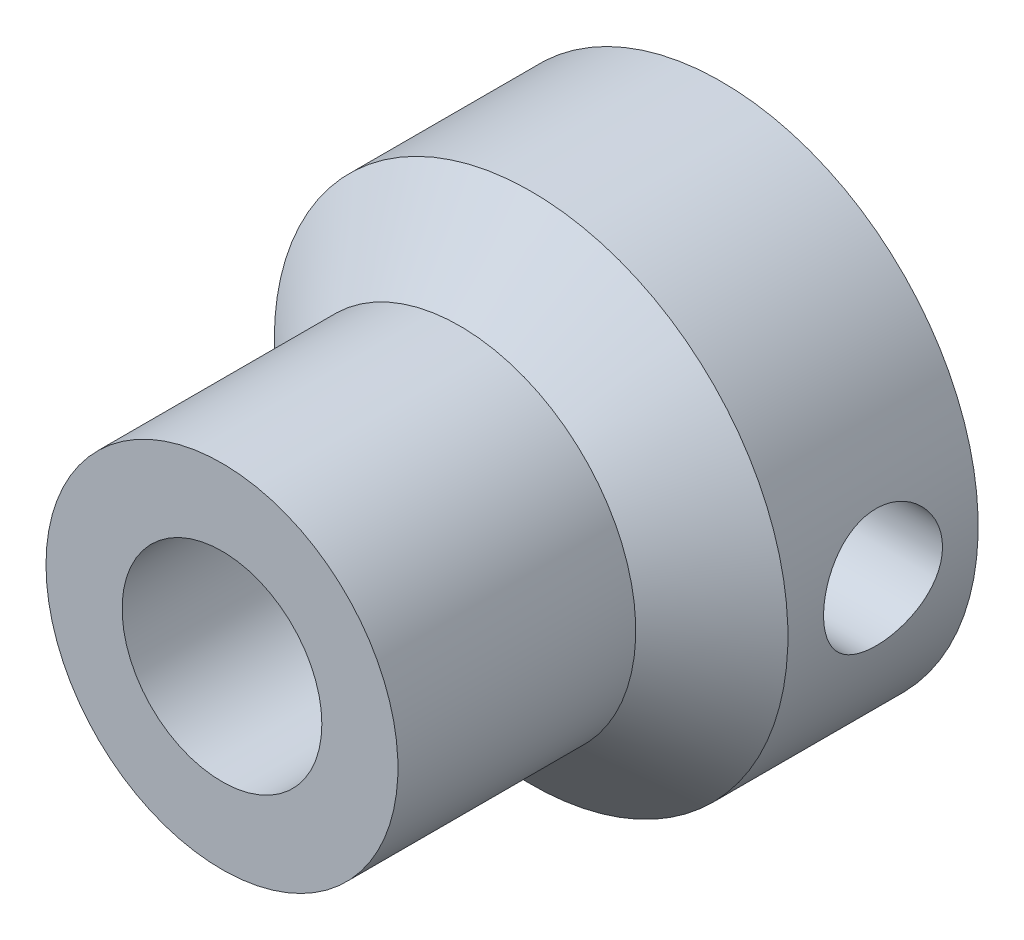
ISO-10303-21;
HEADER;
FILE_DESCRIPTION(('STEP AP214'),'2;1');
FILE_NAME('part.step','',(''),(''),'','','');
FILE_SCHEMA(('AUTOMOTIVE_DESIGN { 1 0 10303 214 1 1 1 1 }'));
ENDSEC;
DATA;
#1=APPLICATION_CONTEXT('core data for automotive mechanical design processes');
#2=APPLICATION_PROTOCOL_DEFINITION('international standard','automotive_design',2000,#1);
#3=PRODUCT_CONTEXT('',#1,'mechanical');
#4=PRODUCT('Part','Part','',(#3));
#5=PRODUCT_RELATED_PRODUCT_CATEGORY('part','',(#4));
#6=PRODUCT_DEFINITION_FORMATION('','',#4);
#7=PRODUCT_DEFINITION_CONTEXT('part definition',#1,'design');
#8=PRODUCT_DEFINITION('design','',#6,#7);
#9=PRODUCT_DEFINITION_SHAPE('','',#8);
#10=(LENGTH_UNIT() NAMED_UNIT(*) SI_UNIT(.MILLI.,.METRE.));
#11=(NAMED_UNIT(*) PLANE_ANGLE_UNIT() SI_UNIT($,.RADIAN.));
#12=(NAMED_UNIT(*) SI_UNIT($,.STERADIAN.) SOLID_ANGLE_UNIT());
#13=UNCERTAINTY_MEASURE_WITH_UNIT(LENGTH_MEASURE(1.E-05),#10,'distance_accuracy_value','');
#14=(GEOMETRIC_REPRESENTATION_CONTEXT(3) GLOBAL_UNCERTAINTY_ASSIGNED_CONTEXT((#13)) GLOBAL_UNIT_ASSIGNED_CONTEXT((#10,
#11,#12)) REPRESENTATION_CONTEXT('',''));
#15=CARTESIAN_POINT('',(0.,0.,0.));
#16=DIRECTION('',(0.,0.,1.));
#17=DIRECTION('',(1.,0.,0.));
#18=AXIS2_PLACEMENT_3D('',#15,#16,#17);
#19=CARTESIAN_POINT('',(0.,0.,0.));
#20=DIRECTION('',(0.,0.,-1.));
#21=DIRECTION('',(-1.,0.,0.));
#22=AXIS2_PLACEMENT_3D('',#19,#20,#21);
#23=CYLINDRICAL_SURFACE('',#22,2.5);
#24=CARTESIAN_POINT('',(-2.5,0.,3.25));
#25=CARTESIAN_POINT('',(-2.49999641755189,-0.0657149536912331,3.24999587210062));
#26=CARTESIAN_POINT('',(-2.49738113774397,-0.131508249622541,3.2447874085979));
#27=CARTESIAN_POINT('',(-2.48717695046745,-0.261150294085531,3.22418389957385));
#28=CARTESIAN_POINT('',(-2.47957859786229,-0.324995108391879,3.20876950875294));
#29=CARTESIAN_POINT('',(-2.4602034925414,-0.448666931100718,3.16850773922901));
#30=CARTESIAN_POINT('',(-2.448442989719,-0.508508503673975,3.14369701968998));
#31=CARTESIAN_POINT('',(-2.42182220644723,-0.623090771008206,3.08553672329382));
#32=CARTESIAN_POINT('',(-2.40696217041913,-0.677831867487562,3.05218781968893));
#33=CARTESIAN_POINT('',(-2.37445322822571,-0.784384772202398,2.97560343814338));
#34=CARTESIAN_POINT('',(-2.3566899890942,-0.835819013902639,2.93189190095045));
#35=CARTESIAN_POINT('',(-2.32074962808431,-0.930974306083721,2.83684815094121));
#36=CARTESIAN_POINT('',(-2.30257220261294,-0.974689478883457,2.78551018528445));
#37=CARTESIAN_POINT('',(-2.26623688996684,-1.05656500056285,2.67189581309577));
#38=CARTESIAN_POINT('',(-2.24818983712665,-1.09403166943955,2.60907987706761));
#39=CARTESIAN_POINT('',(-2.21607473465401,-1.15771028361337,2.47704083001723));
#40=CARTESIAN_POINT('',(-2.20200384508737,-1.18393026870792,2.40782233909656));
#41=CARTESIAN_POINT('',(-2.18072333797261,-1.22266555273573,2.2691686182226));
#42=CARTESIAN_POINT('',(-2.17315339479642,-1.23590732135055,2.19999443491576));
#43=CARTESIAN_POINT('',(-2.1647736243566,-1.25053374163606,2.06002645277565));
#44=CARTESIAN_POINT('',(-2.1639571167911,-1.25193011046634,1.98923432391106));
#45=CARTESIAN_POINT('',(-2.16888662821561,-1.24335910896537,1.85714246960579));
#46=CARTESIAN_POINT('',(-2.17385954577517,-1.23473069942103,1.79571996097119));
#47=CARTESIAN_POINT('',(-2.18845285917313,-1.20867481132116,1.6753476132837));
#48=CARTESIAN_POINT('',(-2.1980747353972,-1.19124452987206,1.61639856836836));
#49=CARTESIAN_POINT('',(-2.22109345515926,-1.1477622254825,1.50096358429293));
#50=CARTESIAN_POINT('',(-2.23457300829998,-1.12151883389499,1.44456700151776));
#51=CARTESIAN_POINT('',(-2.26379255351755,-1.061302109585,1.33670713426249));
#52=CARTESIAN_POINT('',(-2.27953355975238,-1.02732530476558,1.28524608049989));
#53=CARTESIAN_POINT('',(-2.31391447379107,-0.947582568640985,1.18184843407097));
#54=CARTESIAN_POINT('',(-2.33266887795933,-0.900868072961601,1.1306789080298));
#55=CARTESIAN_POINT('',(-2.36934529125509,-0.799444473426716,1.03658072676137));
#56=CARTESIAN_POINT('',(-2.38726689948501,-0.744731570717856,0.993656009957648));
#57=CARTESIAN_POINT('',(-2.42127484103705,-0.62564563228981,0.915392923712842));
#58=CARTESIAN_POINT('',(-2.43723730202509,-0.56094198949926,0.880499409442826));
#59=CARTESIAN_POINT('',(-2.46447351401553,-0.425582769360996,0.82237871369624));
#60=CARTESIAN_POINT('',(-2.47575098679441,-0.354931970331595,0.799142268731042));
#61=CARTESIAN_POINT('',(-2.49155417176795,-0.215958114575877,0.766905745354157));
#62=CARTESIAN_POINT('',(-2.4965617287664,-0.147926913185405,0.756885955316528));
#63=CARTESIAN_POINT('',(-2.50091266823877,-0.0109744999366922,0.748169086081889));
#64=CARTESIAN_POINT('',(-2.5002587340164,0.0579462748373765,0.749466642950652));
#65=CARTESIAN_POINT('',(-2.49363990316801,0.189041214982491,0.762758360523444));
#66=CARTESIAN_POINT('',(-2.48809057110237,0.251324260062442,0.773915665912539));
#67=CARTESIAN_POINT('',(-2.47277714143524,0.373008615377395,0.805297589868858));
#68=CARTESIAN_POINT('',(-2.46301257917916,0.432409607113745,0.8255232080667));
#69=CARTESIAN_POINT('',(-2.43980314267087,0.548610760562081,0.874998083041466));
#70=CARTESIAN_POINT('',(-2.42626102212424,0.605287996257691,0.904488812646017));
#71=CARTESIAN_POINT('',(-2.39679967896386,0.71307670212365,0.971384419557553));
#72=CARTESIAN_POINT('',(-2.38087944457231,0.764185787219102,1.00879266824179));
#73=CARTESIAN_POINT('',(-2.34635276671831,0.864709611613315,1.09470053166609));
#74=CARTESIAN_POINT('',(-2.32763606060552,0.913465097280798,1.14392858556696));
#75=CARTESIAN_POINT('',(-2.29077989504843,1.00232040139155,1.24990643908663));
#76=CARTESIAN_POINT('',(-2.27264084226908,1.04241423211355,1.30666139852047));
#77=CARTESIAN_POINT('',(-2.23813990282585,1.11463489312212,1.42955456775039));
#78=CARTESIAN_POINT('',(-2.2219066207934,1.1462818698483,1.49601408276074));
#79=CARTESIAN_POINT('',(-2.19467590460158,1.19760353251725,1.63438758461565));
#80=CARTESIAN_POINT('',(-2.18367172800773,1.21729364485946,1.70629440812648));
#81=CARTESIAN_POINT('',(-2.16951876260834,1.2423271093121,1.84613777857681));
#82=CARTESIAN_POINT('',(-2.16571729325614,1.24886624550108,1.91379281678629));
#83=CARTESIAN_POINT('',(-2.16456693307719,1.25086144297598,2.04930883396341));
#84=CARTESIAN_POINT('',(-2.16721524534441,1.2463223082805,2.11716971092429));
#85=CARTESIAN_POINT('',(-2.17797327562531,1.22740765699033,2.24435437691502));
#86=CARTESIAN_POINT('',(-2.18553868102992,1.2140103929285,2.3038755876805));
#87=CARTESIAN_POINT('',(-2.20463770234897,1.17896919778081,2.41976014928088));
#88=CARTESIAN_POINT('',(-2.21617259462095,1.15732261394976,2.47612247761496));
#89=CARTESIAN_POINT('',(-2.2428566295566,1.10476968162585,2.58828106373326));
#90=CARTESIAN_POINT('',(-2.25819652995238,1.07333892227057,2.64378487728712));
#91=CARTESIAN_POINT('',(-2.29044164543238,1.00268871454579,2.74909317022573));
#92=CARTESIAN_POINT('',(-2.30734767243153,0.963465214048309,2.79889466314811));
#93=CARTESIAN_POINT('',(-2.34327903949141,0.872754158330801,2.89767747794702));
#94=CARTESIAN_POINT('',(-2.36231229139336,0.820355528762713,2.9458238779524));
#95=CARTESIAN_POINT('',(-2.3984719031886,0.707693507775349,3.03282872927954));
#96=CARTESIAN_POINT('',(-2.4155972326005,0.647425904070981,3.07168217428286));
#97=CARTESIAN_POINT('',(-2.44622511981379,0.519914496024933,3.13904545345275));
#98=CARTESIAN_POINT('',(-2.45970120703636,0.452624379918268,3.16748021176429));
#99=CARTESIAN_POINT('',(-2.48126676704332,0.313427626617739,3.21226020989869));
#100=CARTESIAN_POINT('',(-2.48937154216165,0.241534749528958,3.22863980853697));
#101=CARTESIAN_POINT('',(-2.49619327387079,0.14075243310423,3.24237176384481));
#102=CARTESIAN_POINT('',(-2.49761706674002,0.112702349299373,3.24522830107952));
#103=CARTESIAN_POINT('',(-2.49952121222331,0.0564396647589472,3.24904333189601));
#104=CARTESIAN_POINT('',(-2.50000153879704,0.0282270595592268,3.250001773089));
#105=CARTESIAN_POINT('',(-2.5,0.,3.25));
#106=B_SPLINE_CURVE_WITH_KNOTS('',3,(#24,#25,#26,#27,#28,#29,#30,#31,#32,#33,#34,#35,#36,#37,
#38,#39,#40,#41,#42,#43,#44,#45,#46,#47,#48,#49,#50,#51,#52,#53,#54,#55,#56,#57,#58,#59,#60,#61,
#62,#63,#64,#65,#66,#67,#68,#69,#70,#71,#72,#73,#74,#75,#76,#77,#78,#79,#80,#81,#82,#83,#84,#85,
#86,#87,#88,#89,#90,#91,#92,#93,#94,#95,#96,#97,#98,#99,#100,#101,#102,#103,#104,#105),
.UNSPECIFIED.,.T.,.F.,(4,2,2,2,2,2,2,2,2,2,2,2,2,2,2,2,2,2,2,2,2,2,2,2,2,2,2,2,2,2,2,2,2,2,2,2,
2,2,2,2,4),(0.,0.197030321775365,0.394435187136497,0.591077694365372,0.787704700726959,
0.99622719839761,1.20490779706754,1.42977158038441,1.65447434872851,1.86572515175287,
2.07676696661275,2.2625714051165,2.44843504907098,2.63862800210609,2.82890651575277,
3.04331176667348,3.25781918248358,3.4822877776805,3.70657771140349,3.91229113089182,
4.11790705639345,4.30758633132652,4.49728652038664,4.69241070034873,4.88761813435424,
5.10199513305523,5.31651985769289,5.54143352699592,5.76605639925972,5.96911634372966,
6.17208824825006,6.35572412805228,6.53941910979597,6.73545570969517,6.93159451423697,
7.15156553440622,7.37165479220715,7.59330017078656,7.81431135781162,7.89894100172121,
7.98357298143558),.UNSPECIFIED.);
#107=CARTESIAN_POINT('',(-2.5,0.,3.25));
#108=VERTEX_POINT('',#107);
#109=EDGE_CURVE('E123',#108,#108,#106,.T.);
#110=ORIENTED_EDGE('',*,*,#109,.F.);
#111=EDGE_LOOP('',(#110));
#112=FACE_BOUND('',#111,.T.);
#113=CARTESIAN_POINT('',(2.5,0.,0.750000000000001));
#114=CARTESIAN_POINT('',(2.49999641755189,-0.065714953691233,0.750004127899377));
#115=CARTESIAN_POINT('',(2.49738113774397,-0.13150824962254,0.755212591402095));
#116=CARTESIAN_POINT('',(2.48717695046745,-0.261150294085531,0.775816100426148));
#117=CARTESIAN_POINT('',(2.47957859786229,-0.324995108391879,0.791230491247063));
#118=CARTESIAN_POINT('',(2.4602034925414,-0.448666931100717,0.831492260770994));
#119=CARTESIAN_POINT('',(2.448442989719,-0.508508503673974,0.856302980310016));
#120=CARTESIAN_POINT('',(2.42182220644723,-0.623090771008206,0.914463276706177));
#121=CARTESIAN_POINT('',(2.40696217041913,-0.677831867487562,0.947812180311066));
#122=CARTESIAN_POINT('',(2.37445322822571,-0.784384772202398,1.02439656185662));
#123=CARTESIAN_POINT('',(2.3566899890942,-0.835819013902639,1.06810809904955));
#124=CARTESIAN_POINT('',(2.32074962808431,-0.930974306083721,1.16315184905879));
#125=CARTESIAN_POINT('',(2.30257220261294,-0.974689478883457,1.21448981471555));
#126=CARTESIAN_POINT('',(2.26623688996684,-1.05656500056285,1.32810418690423));
#127=CARTESIAN_POINT('',(2.24818983712665,-1.09403166943955,1.39092012293239));
#128=CARTESIAN_POINT('',(2.21607473465401,-1.15771028361337,1.52295916998277));
#129=CARTESIAN_POINT('',(2.20200384508737,-1.18393026870792,1.59217766090344));
#130=CARTESIAN_POINT('',(2.18072333797261,-1.22266555273573,1.7308313817774));
#131=CARTESIAN_POINT('',(2.17315339479642,-1.23590732135055,1.80000556508424));
#132=CARTESIAN_POINT('',(2.1647736243566,-1.25053374163606,1.93997354722435));
#133=CARTESIAN_POINT('',(2.1639571167911,-1.25193011046634,2.01076567608894));
#134=CARTESIAN_POINT('',(2.16888662821561,-1.24335910896537,2.14285753039421));
#135=CARTESIAN_POINT('',(2.17385954577517,-1.23473069942103,2.20428003902881));
#136=CARTESIAN_POINT('',(2.18845285917313,-1.20867481132116,2.3246523867163));
#137=CARTESIAN_POINT('',(2.1980747353972,-1.19124452987206,2.38360143163164));
#138=CARTESIAN_POINT('',(2.22109345515926,-1.1477622254825,2.49903641570707));
#139=CARTESIAN_POINT('',(2.23457300829998,-1.12151883389499,2.55543299848224));
#140=CARTESIAN_POINT('',(2.26379255351755,-1.061302109585,2.66329286573751));
#141=CARTESIAN_POINT('',(2.27953355975238,-1.02732530476558,2.71475391950011));
#142=CARTESIAN_POINT('',(2.31391447379107,-0.947582568640985,2.81815156592903));
#143=CARTESIAN_POINT('',(2.33266887795933,-0.900868072961601,2.8693210919702));
#144=CARTESIAN_POINT('',(2.36934529125509,-0.799444473426716,2.96341927323863));
#145=CARTESIAN_POINT('',(2.38726689948501,-0.744731570717856,3.00634399004235));
#146=CARTESIAN_POINT('',(2.42127484103705,-0.62564563228981,3.08460707628716));
#147=CARTESIAN_POINT('',(2.43723730202509,-0.56094198949926,3.11950059055717));
#148=CARTESIAN_POINT('',(2.46447351401553,-0.425582769360996,3.17762128630376));
#149=CARTESIAN_POINT('',(2.47575098679441,-0.354931970331595,3.20085773126896));
#150=CARTESIAN_POINT('',(2.49155417176795,-0.215958114575877,3.23309425464584));
#151=CARTESIAN_POINT('',(2.4965617287664,-0.147926913185405,3.24311404468347));
#152=CARTESIAN_POINT('',(2.50091266823877,-0.0109744999366918,3.25183091391811));
#153=CARTESIAN_POINT('',(2.5002587340164,0.0579462748373768,3.25053335704935));
#154=CARTESIAN_POINT('',(2.49363990316801,0.189041214982492,3.23724163947656));
#155=CARTESIAN_POINT('',(2.48809057110237,0.251324260062443,3.22608433408746));
#156=CARTESIAN_POINT('',(2.47277714143524,0.373008615377396,3.19470241013114));
#157=CARTESIAN_POINT('',(2.46301257917916,0.432409607113746,3.1744767919333));
#158=CARTESIAN_POINT('',(2.43980314267087,0.548610760562081,3.12500191695853));
#159=CARTESIAN_POINT('',(2.42626102212424,0.605287996257691,3.09551118735398));
#160=CARTESIAN_POINT('',(2.39679967896386,0.71307670212365,3.02861558044245));
#161=CARTESIAN_POINT('',(2.38087944457231,0.764185787219102,2.99120733175821));
#162=CARTESIAN_POINT('',(2.34635276671831,0.864709611613316,2.90529946833391));
#163=CARTESIAN_POINT('',(2.32763606060552,0.913465097280798,2.85607141443304));
#164=CARTESIAN_POINT('',(2.29077989504843,1.00232040139155,2.75009356091337));
#165=CARTESIAN_POINT('',(2.27264084226908,1.04241423211355,2.69333860147953));
#166=CARTESIAN_POINT('',(2.23813990282585,1.11463489312212,2.57044543224961));
#167=CARTESIAN_POINT('',(2.2219066207934,1.1462818698483,2.50398591723926));
#168=CARTESIAN_POINT('',(2.19467590460158,1.19760353251725,2.36561241538435));
#169=CARTESIAN_POINT('',(2.18367172800773,1.21729364485946,2.29370559187352));
#170=CARTESIAN_POINT('',(2.16951876260834,1.2423271093121,2.15386222142319));
#171=CARTESIAN_POINT('',(2.16571729325614,1.24886624550108,2.0862071832137));
#172=CARTESIAN_POINT('',(2.16456693307719,1.25086144297598,1.95069116603659));
#173=CARTESIAN_POINT('',(2.16721524534441,1.2463223082805,1.88283028907571));
#174=CARTESIAN_POINT('',(2.17797327562531,1.22740765699033,1.75564562308498));
#175=CARTESIAN_POINT('',(2.18553868102992,1.2140103929285,1.6961244123195));
#176=CARTESIAN_POINT('',(2.20463770234897,1.17896919778081,1.58023985071912));
#177=CARTESIAN_POINT('',(2.21617259462095,1.15732261394976,1.52387752238504));
#178=CARTESIAN_POINT('',(2.2428566295566,1.10476968162585,1.41171893626674));
#179=CARTESIAN_POINT('',(2.25819652995238,1.07333892227057,1.35621512271287));
#180=CARTESIAN_POINT('',(2.29044164543238,1.00268871454579,1.25090682977427));
#181=CARTESIAN_POINT('',(2.30734767243153,0.963465214048309,1.20110533685189));
#182=CARTESIAN_POINT('',(2.34327903949141,0.8727541583308,1.10232252205298));
#183=CARTESIAN_POINT('',(2.36231229139336,0.820355528762713,1.0541761220476));
#184=CARTESIAN_POINT('',(2.3984719031886,0.707693507775348,0.96717127072046));
#185=CARTESIAN_POINT('',(2.4155972326005,0.64742590407098,0.928317825717139));
#186=CARTESIAN_POINT('',(2.44622511981379,0.519914496024932,0.860954546547245));
#187=CARTESIAN_POINT('',(2.45970120703636,0.452624379918267,0.832519788235707));
#188=CARTESIAN_POINT('',(2.48126676704332,0.313427626617738,0.787739790101311));
#189=CARTESIAN_POINT('',(2.48937154216165,0.241534749528956,0.771360191463029));
#190=CARTESIAN_POINT('',(2.49619327387079,0.140752433104229,0.757628236155189));
#191=CARTESIAN_POINT('',(2.49761706674002,0.112702349299373,0.754771698920477));
#192=CARTESIAN_POINT('',(2.49952121222331,0.0564396647589471,0.750956668103994));
#193=CARTESIAN_POINT('',(2.50000153879704,0.0282270595592268,0.749998226911001));
#194=CARTESIAN_POINT('',(2.5,0.,0.750000000000001));
#195=B_SPLINE_CURVE_WITH_KNOTS('',3,(#113,#114,#115,#116,#117,#118,#119,#120,#121,#122,#123,
#124,#125,#126,#127,#128,#129,#130,#131,#132,#133,#134,#135,#136,#137,#138,#139,#140,#141,#142,
#143,#144,#145,#146,#147,#148,#149,#150,#151,#152,#153,#154,#155,#156,#157,#158,#159,#160,#161,
#162,#163,#164,#165,#166,#167,#168,#169,#170,#171,#172,#173,#174,#175,#176,#177,#178,#179,#180,
#181,#182,#183,#184,#185,#186,#187,#188,#189,#190,#191,#192,#193,#194),.UNSPECIFIED.,.T.,.F.,(4,
2,2,2,2,2,2,2,2,2,2,2,2,2,2,2,2,2,2,2,2,2,2,2,2,2,2,2,2,2,2,2,2,2,2,2,2,2,2,2,4),(0.,
0.197030321775365,0.394435187136497,0.591077694365372,0.787704700726959,0.99622719839761,
1.20490779706754,1.42977158038441,1.65447434872851,1.86572515175287,2.07676696661275,
2.26257140511651,2.44843504907098,2.63862800210609,2.82890651575277,3.04331176667348,
3.25781918248358,3.4822877776805,3.70657771140349,3.91229113089182,4.11790705639345,
4.30758633132652,4.49728652038664,4.69241070034873,4.88761813435423,5.10199513305523,
5.31651985769289,5.54143352699592,5.76605639925971,5.96911634372966,6.17208824825006,
6.35572412805228,6.53941910979597,6.73545570969517,6.93159451423696,7.15156553440622,
7.37165479220715,7.59330017078656,7.81431135781162,7.89894100172121,7.98357298143558),.UNSPECIFIED.);
#196=CARTESIAN_POINT('',(2.5,0.,0.750000000000001));
#197=VERTEX_POINT('',#196);
#198=EDGE_CURVE('E79',#197,#197,#195,.T.);
#199=ORIENTED_EDGE('',*,*,#198,.F.);
#200=EDGE_LOOP('',(#199));
#201=FACE_BOUND('',#200,.T.);
#202=CARTESIAN_POINT('',(0.,0.,0.));
#203=DIRECTION('',(0.,0.,-1.));
#204=DIRECTION('',(-1.,0.,0.));
#205=AXIS2_PLACEMENT_3D('',#202,#203,#204);
#206=CIRCLE('',#205,2.5);
#207=CARTESIAN_POINT('',(-2.5,0.,0.));
#208=VERTEX_POINT('',#207);
#209=EDGE_CURVE('E62',#208,#208,#206,.T.);
#210=ORIENTED_EDGE('',*,*,#209,.T.);
#211=EDGE_LOOP('',(#210));
#212=FACE_BOUND('',#211,.T.);
#213=CARTESIAN_POINT('',(0.,0.,5.));
#214=DIRECTION('',(0.,0.,-1.));
#215=DIRECTION('',(-1.,0.,0.));
#216=AXIS2_PLACEMENT_3D('',#213,#214,#215);
#217=CIRCLE('',#216,2.5);
#218=CARTESIAN_POINT('',(-2.5,0.,5.));
#219=VERTEX_POINT('',#218);
#220=EDGE_CURVE('E10',#219,#219,#217,.T.);
#221=ORIENTED_EDGE('',*,*,#220,.F.);
#222=EDGE_LOOP('',(#221));
#223=FACE_BOUND('',#222,.T.);
#224=ADVANCED_FACE('F40',(#112,#201,#212,#223),#23,.F.);
#225=CARTESIAN_POINT('',(-1.,0.,5.));
#226=DIRECTION('',(0.,0.,-1.));
#227=DIRECTION('',(-1.,0.,0.));
#228=AXIS2_PLACEMENT_3D('',#225,#226,#227);
#229=PLANE('',#228);
#230=CARTESIAN_POINT('',(0.,0.,5.));
#231=DIRECTION('',(0.,0.,-1.));
#232=DIRECTION('',(-1.,0.,0.));
#233=AXIS2_PLACEMENT_3D('',#230,#231,#232);
#234=CIRCLE('',#233,2.09999999999999);
#235=CARTESIAN_POINT('',(-2.09999999999999,0.,5.));
#236=VERTEX_POINT('',#235);
#237=EDGE_CURVE('E65',#236,#236,#234,.T.);
#238=ORIENTED_EDGE('',*,*,#237,.F.);
#239=EDGE_LOOP('',(#238));
#240=FACE_BOUND('',#239,.T.);
#241=ORIENTED_EDGE('',*,*,#220,.T.);
#242=EDGE_LOOP('',(#241));
#243=FACE_BOUND('',#242,.T.);
#244=ADVANCED_FACE('F113',(#240,#243),#229,.T.);
#245=CARTESIAN_POINT('',(-1.,0.,10.5));
#246=DIRECTION('',(0.,0.,1.));
#247=DIRECTION('',(1.,0.,0.));
#248=AXIS2_PLACEMENT_3D('',#245,#246,#247);
#249=PLANE('',#248);
#250=CARTESIAN_POINT('',(0.,0.,10.5));
#251=DIRECTION('',(0.,0.,1.));
#252=DIRECTION('',(1.,0.,0.));
#253=AXIS2_PLACEMENT_3D('',#250,#251,#252);
#254=CIRCLE('',#253,2.09999999999999);
#255=CARTESIAN_POINT('',(2.09999999999999,0.,10.5));
#256=VERTEX_POINT('',#255);
#257=EDGE_CURVE('E68',#256,#256,#254,.T.);
#258=ORIENTED_EDGE('',*,*,#257,.F.);
#259=EDGE_LOOP('',(#258));
#260=FACE_BOUND('',#259,.T.);
#261=CARTESIAN_POINT('',(0.,0.,10.5));
#262=DIRECTION('',(0.,0.,-1.));
#263=DIRECTION('',(-1.,0.,0.));
#264=AXIS2_PLACEMENT_3D('',#261,#262,#263);
#265=CIRCLE('',#264,3.7);
#266=CARTESIAN_POINT('',(-3.7,0.,10.5));
#267=VERTEX_POINT('',#266);
#268=EDGE_CURVE('E46',#267,#267,#265,.T.);
#269=ORIENTED_EDGE('',*,*,#268,.F.);
#270=EDGE_LOOP('',(#269));
#271=FACE_BOUND('',#270,.T.);
#272=ADVANCED_FACE('F118',(#260,#271),#249,.T.);
#273=CARTESIAN_POINT('',(0.,0.,0.));
#274=DIRECTION('',(0.,0.,-1.));
#275=DIRECTION('',(-1.,0.,0.));
#276=AXIS2_PLACEMENT_3D('',#273,#274,#275);
#277=CYLINDRICAL_SURFACE('',#276,3.7);
#278=ORIENTED_EDGE('',*,*,#268,.T.);
#279=EDGE_LOOP('',(#278));
#280=FACE_BOUND('',#279,.T.);
#281=CARTESIAN_POINT('',(0.,0.,5.5));
#282=DIRECTION('',(0.,0.,-1.));
#283=DIRECTION('',(-1.,0.,0.));
#284=AXIS2_PLACEMENT_3D('',#281,#282,#283);
#285=CIRCLE('',#284,3.7);
#286=CARTESIAN_POINT('',(-3.7,0.,5.5));
#287=VERTEX_POINT('',#286);
#288=EDGE_CURVE('E50',#287,#287,#285,.T.);
#289=ORIENTED_EDGE('',*,*,#288,.F.);
#290=EDGE_LOOP('',(#289));
#291=FACE_BOUND('',#290,.T.);
#292=ADVANCED_FACE('F211',(#280,#291),#277,.T.);
#293=CARTESIAN_POINT('',(0.,0.,4.));
#294=DIRECTION('',(0.,0.,-1.));
#295=DIRECTION('',(-1.,0.,0.));
#296=AXIS2_PLACEMENT_3D('',#293,#294,#295);
#297=CONICAL_SURFACE('',#296,5.4,0.847816973393405);
#298=ORIENTED_EDGE('',*,*,#288,.T.);
#299=EDGE_LOOP('',(#298));
#300=FACE_BOUND('',#299,.T.);
#301=CARTESIAN_POINT('',(0.,0.,4.));
#302=DIRECTION('',(0.,0.,-1.));
#303=DIRECTION('',(-1.,0.,0.));
#304=AXIS2_PLACEMENT_3D('',#301,#302,#303);
#305=CIRCLE('',#304,5.4);
#306=CARTESIAN_POINT('',(-5.4,0.,4.));
#307=VERTEX_POINT('',#306);
#308=EDGE_CURVE('E54',#307,#307,#305,.T.);
#309=ORIENTED_EDGE('',*,*,#308,.F.);
#310=EDGE_LOOP('',(#309));
#311=FACE_BOUND('',#310,.T.);
#312=ADVANCED_FACE('F109',(#300,#311),#297,.T.);
#313=CARTESIAN_POINT('',(0.,0.,0.));
#314=DIRECTION('',(0.,0.,-1.));
#315=DIRECTION('',(-1.,0.,0.));
#316=AXIS2_PLACEMENT_3D('',#313,#314,#315);
#317=CYLINDRICAL_SURFACE('',#316,5.4);
#318=CARTESIAN_POINT('',(-5.4,0.,3.25));
#319=CARTESIAN_POINT('',(-5.39999874823438,0.0692241871145403,3.24999778822904));
#320=CARTESIAN_POINT('',(-5.39865546800572,0.138474266427772,3.24423022207204));
#321=CARTESIAN_POINT('',(-5.39342675426803,0.275000425366631,3.22134043929941));
#322=CARTESIAN_POINT('',(-5.38953965210246,0.342275178961732,3.20421076944861));
#323=CARTESIAN_POINT('',(-5.37965516979212,0.472858483968851,3.15916755790865));
#324=CARTESIAN_POINT('',(-5.37366012568423,0.536171334869417,3.13126595042019));
#325=CARTESIAN_POINT('',(-5.36020341061013,0.657216106152046,3.06551041862905));
#326=CARTESIAN_POINT('',(-5.35274174258654,0.714948037731248,3.02765651429448));
#327=CARTESIAN_POINT('',(-5.33701743019704,0.824223728513662,2.9423565507572));
#328=CARTESIAN_POINT('',(-5.32874387739558,0.875653654684865,2.8947666629363));
#329=CARTESIAN_POINT('',(-5.31240337894845,0.969877453577131,2.79165408188479));
#330=CARTESIAN_POINT('',(-5.30433645361578,1.01267048005084,2.73613061222766));
#331=CARTESIAN_POINT('',(-5.2892141261743,1.08892093571322,2.61786874450375));
#332=CARTESIAN_POINT('',(-5.28217265376136,1.12225476741282,2.55504871438924));
#333=CARTESIAN_POINT('',(-5.27005610560817,1.17784701650963,2.42450821814353));
#334=CARTESIAN_POINT('',(-5.26498076415844,1.20010693058863,2.35678841565295));
#335=CARTESIAN_POINT('',(-5.25748265119255,1.23253847327747,2.21961236657041));
#336=CARTESIAN_POINT('',(-5.2550154349981,1.24291290618177,2.15020655062519));
#337=CARTESIAN_POINT('',(-5.25287961956346,1.25191004217409,2.01059909833359));
#338=CARTESIAN_POINT('',(-5.25321063325227,1.25053437061961,1.94039757339692));
#339=CARTESIAN_POINT('',(-5.25659375047557,1.23623300176578,1.80271715578438));
#340=CARTESIAN_POINT('',(-5.25958979574762,1.22354523877694,1.73521195929967));
#341=CARTESIAN_POINT('',(-5.2678764915052,1.18735782432143,1.60331512329875));
#342=CARTESIAN_POINT('',(-5.2731672844797,1.16385750145935,1.53892367740228));
#343=CARTESIAN_POINT('',(-5.28550107960884,1.10649981926167,1.41442546906195));
#344=CARTESIAN_POINT('',(-5.29255911403959,1.07255300269372,1.35436147197518));
#345=CARTESIAN_POINT('',(-5.30762320463089,0.995328718186157,1.24069540145175));
#346=CARTESIAN_POINT('',(-5.31562940449809,0.952049835034112,1.18709431004231));
#347=CARTESIAN_POINT('',(-5.33192650722274,0.856141032424574,1.0865081306382));
#348=CARTESIAN_POINT('',(-5.34021959983535,0.803309372870151,1.03971554598428));
#349=CARTESIAN_POINT('',(-5.35597952063802,0.690452447512654,0.955620985009378));
#350=CARTESIAN_POINT('',(-5.36344633016309,0.630427019272688,0.918319223052688));
#351=CARTESIAN_POINT('',(-5.37674137922928,0.504635960206346,0.854208653523968));
#352=CARTESIAN_POINT('',(-5.38256529931455,0.43885578247979,0.827427435210715));
#353=CARTESIAN_POINT('',(-5.39188660170977,0.303563395155949,0.785353729971639));
#354=CARTESIAN_POINT('',(-5.39538436395879,0.234051797029328,0.770059366806916));
#355=CARTESIAN_POINT('',(-5.39960432194415,0.0949188474226052,0.751678993176806));
#356=CARTESIAN_POINT('',(-5.40038621683971,0.0253339536305767,0.748330351116326));
#357=CARTESIAN_POINT('',(-5.39925471054082,-0.113401199396408,0.753221298340919));
#358=CARTESIAN_POINT('',(-5.39734151538226,-0.182551491450132,0.761460001789439));
#359=CARTESIAN_POINT('',(-5.39107270805315,-0.317567653128892,0.789074433096551));
#360=CARTESIAN_POINT('',(-5.38674779900457,-0.383463694391253,0.808310234904449));
#361=CARTESIAN_POINT('',(-5.37614070405043,-0.511092660604727,0.857215749828567));
#362=CARTESIAN_POINT('',(-5.3698583382899,-0.572825202371076,0.886886421753313));
#363=CARTESIAN_POINT('',(-5.35588743525236,-0.691444779334463,0.956351522676177));
#364=CARTESIAN_POINT('',(-5.34817839030347,-0.748240639647342,0.996297423893506));
#365=CARTESIAN_POINT('',(-5.33224710804932,-0.854416896018497,1.08498195450348));
#366=CARTESIAN_POINT('',(-5.32402479563046,-0.903796203090457,1.13372187282975));
#367=CARTESIAN_POINT('',(-5.30778399091491,-0.994793544081783,1.23982216341076));
#368=CARTESIAN_POINT('',(-5.29977329933032,-1.0362287089936,1.29734080199619));
#369=CARTESIAN_POINT('',(-5.28505640511214,-1.10885407052095,1.41867326774298));
#370=CARTESIAN_POINT('',(-5.27835014441881,-1.14004472315851,1.48248681452967));
#371=CARTESIAN_POINT('',(-5.26706995749014,-1.19107407331668,1.61424946837316));
#372=CARTESIAN_POINT('',(-5.2624836492151,-1.21097884732069,1.68217187160618));
#373=CARTESIAN_POINT('',(-5.2559438279697,-1.23905858603521,1.82051879217987));
#374=CARTESIAN_POINT('',(-5.25398983488665,-1.24723568979417,1.89094285083346));
#375=CARTESIAN_POINT('',(-5.25296867632895,-1.2515285845306,2.03044384980091));
#376=CARTESIAN_POINT('',(-5.25383190937952,-1.24793516606778,2.0995114869658));
#377=CARTESIAN_POINT('',(-5.25818914739366,-1.22944516739717,2.23602790471553));
#378=CARTESIAN_POINT('',(-5.26168311330701,-1.21454875496928,2.30347670931475));
#379=CARTESIAN_POINT('',(-5.27087224339566,-1.17402355997323,2.43457638910462));
#380=CARTESIAN_POINT('',(-5.27655773123556,-1.1484419154902,2.4982425593452));
#381=CARTESIAN_POINT('',(-5.28949203841655,-1.08731126166201,2.62042080878085));
#382=CARTESIAN_POINT('',(-5.2967410425912,-1.05176107372034,2.67893227745183));
#383=CARTESIAN_POINT('',(-5.31218981239259,-0.970758826498258,2.79056274138232));
#384=CARTESIAN_POINT('',(-5.32040732565605,-0.925101635822059,2.84353045904755));
#385=CARTESIAN_POINT('',(-5.33675342745657,-0.825590992830996,2.94114747275733));
#386=CARTESIAN_POINT('',(-5.34488199482159,-0.771735632696652,2.98579482715316));
#387=CARTESIAN_POINT('',(-5.36027855985255,-0.656388355565246,3.06614643938877));
#388=CARTESIAN_POINT('',(-5.36753191208641,-0.594794510125285,3.10170736226895));
#389=CARTESIAN_POINT('',(-5.38021121124879,-0.466345339684815,3.16191412325139));
#390=CARTESIAN_POINT('',(-5.3856386038694,-0.399494229079048,3.18656860135646));
#391=CARTESIAN_POINT('',(-5.39315038381651,-0.277203903682883,3.22015323222038));
#392=CARTESIAN_POINT('',(-5.39570241420179,-0.222397521091904,3.23132333566444));
#393=CARTESIAN_POINT('',(-5.3991276811903,-0.111733009859767,3.24624740769058));
#394=CARTESIAN_POINT('',(-5.40000101037414,-0.0558749393909185,3.25000178525128));
#395=CARTESIAN_POINT('',(-5.4,0.,3.25));
#396=B_SPLINE_CURVE_WITH_KNOTS('',3,(#318,#319,#320,#321,#322,#323,#324,#325,#326,#327,#328,
#329,#330,#331,#332,#333,#334,#335,#336,#337,#338,#339,#340,#341,#342,#343,#344,#345,#346,#347,
#348,#349,#350,#351,#352,#353,#354,#355,#356,#357,#358,#359,#360,#361,#362,#363,#364,#365,#366,
#367,#368,#369,#370,#371,#372,#373,#374,#375,#376,#377,#378,#379,#380,#381,#382,#383,#384,#385,
#386,#387,#388,#389,#390,#391,#392,#393,#394,#395),.UNSPECIFIED.,.T.,.F.,(4,2,2,2,2,2,2,2,2,2,2,
2,2,2,2,2,2,2,2,2,2,2,2,2,2,2,2,2,2,2,2,2,2,2,2,2,2,2,4),(0.,0.207467946105603,
0.415072120385803,0.622446947561194,0.829821358666675,1.04051486741415,1.25122900999614,
1.46458145535715,1.67790505749033,1.88753176908611,2.09712948410295,2.30241996008224,
2.50772318509512,2.71483586958108,2.92197998492394,3.1341595790516,3.34634396514453,
3.55908113091197,3.77178354107411,3.97977975138832,4.1877600615439,4.39315114378166,
4.59856110332142,4.80719248561258,5.01585447175303,5.2288581378352,5.44185232103247,
5.65358623747827,5.86528153016325,6.07178671705002,6.27828883866533,6.48388943660925,
6.68951435329084,6.89977416821969,7.11008298832518,7.32352890318485,7.5368054236744,
7.70427432097336,7.87173398207459),.UNSPECIFIED.);
#397=CARTESIAN_POINT('',(-5.4,0.,3.25));
#398=VERTEX_POINT('',#397);
#399=EDGE_CURVE('E130',#398,#398,#396,.T.);
#400=ORIENTED_EDGE('',*,*,#399,.F.);
#401=EDGE_LOOP('',(#400));
#402=FACE_BOUND('',#401,.T.);
#403=CARTESIAN_POINT('',(5.4,0.,0.750000000000001));
#404=CARTESIAN_POINT('',(5.39999874823438,0.0692241871145403,0.750002211770963));
#405=CARTESIAN_POINT('',(5.39865546800572,0.138474266427772,0.755769777927965));
#406=CARTESIAN_POINT('',(5.39342675426803,0.275000425366631,0.778659560700592));
#407=CARTESIAN_POINT('',(5.38953965210246,0.342275178961732,0.795789230551391));
#408=CARTESIAN_POINT('',(5.37965516979212,0.472858483968851,0.840832442091347));
#409=CARTESIAN_POINT('',(5.37366012568423,0.536171334869416,0.868734049579805));
#410=CARTESIAN_POINT('',(5.36020341061013,0.657216106152046,0.934489581370946));
#411=CARTESIAN_POINT('',(5.35274174258654,0.714948037731248,0.97234348570552));
#412=CARTESIAN_POINT('',(5.33701743019704,0.824223728513662,1.0576434492428));
#413=CARTESIAN_POINT('',(5.32874387739558,0.875653654684864,1.1052333370637));
#414=CARTESIAN_POINT('',(5.31240337894845,0.969877453577131,1.20834591811521));
#415=CARTESIAN_POINT('',(5.30433645361578,1.01267048005084,1.26386938777234));
#416=CARTESIAN_POINT('',(5.2892141261743,1.08892093571322,1.38213125549625));
#417=CARTESIAN_POINT('',(5.28217265376136,1.12225476741282,1.44495128561076));
#418=CARTESIAN_POINT('',(5.27005610560817,1.17784701650963,1.57549178185647));
#419=CARTESIAN_POINT('',(5.26498076415844,1.20010693058863,1.64321158434705));
#420=CARTESIAN_POINT('',(5.25748265119255,1.23253847327747,1.78038763342959));
#421=CARTESIAN_POINT('',(5.2550154349981,1.24291290618177,1.84979344937481));
#422=CARTESIAN_POINT('',(5.25287961956346,1.25191004217409,1.98940090166641));
#423=CARTESIAN_POINT('',(5.25321063325227,1.25053437061961,2.05960242660308));
#424=CARTESIAN_POINT('',(5.25659375047557,1.23623300176578,2.19728284421562));
#425=CARTESIAN_POINT('',(5.25958979574762,1.22354523877694,2.26478804070032));
#426=CARTESIAN_POINT('',(5.2678764915052,1.18735782432143,2.39668487670125));
#427=CARTESIAN_POINT('',(5.2731672844797,1.16385750145935,2.46107632259772));
#428=CARTESIAN_POINT('',(5.28550107960884,1.10649981926167,2.58557453093805));
#429=CARTESIAN_POINT('',(5.29255911403959,1.07255300269372,2.64563852802482));
#430=CARTESIAN_POINT('',(5.30762320463089,0.995328718186158,2.75930459854825));
#431=CARTESIAN_POINT('',(5.31562940449809,0.952049835034112,2.81290568995769));
#432=CARTESIAN_POINT('',(5.33192650722274,0.856141032424575,2.9134918693618));
#433=CARTESIAN_POINT('',(5.34021959983535,0.803309372870152,2.96028445401572));
#434=CARTESIAN_POINT('',(5.35597952063802,0.690452447512654,3.04437901499062));
#435=CARTESIAN_POINT('',(5.36344633016309,0.630427019272688,3.08168077694731));
#436=CARTESIAN_POINT('',(5.37674137922928,0.504635960206347,3.14579134647603));
#437=CARTESIAN_POINT('',(5.38256529931455,0.438855782479791,3.17257256478928));
#438=CARTESIAN_POINT('',(5.39188660170977,0.30356339515595,3.21464627002836));
#439=CARTESIAN_POINT('',(5.39538436395879,0.234051797029329,3.22994063319308));
#440=CARTESIAN_POINT('',(5.39960432194415,0.0949188474226058,3.24832100682319));
#441=CARTESIAN_POINT('',(5.40038621683971,0.0253339536305773,3.25166964888367));
#442=CARTESIAN_POINT('',(5.39925471054082,-0.113401199396407,3.24677870165908));
#443=CARTESIAN_POINT('',(5.39734151538226,-0.182551491450131,3.23853999821056));
#444=CARTESIAN_POINT('',(5.39107270805315,-0.317567653128891,3.21092556690345));
#445=CARTESIAN_POINT('',(5.38674779900457,-0.383463694391253,3.19168976509555));
#446=CARTESIAN_POINT('',(5.37614070405043,-0.511092660604726,3.14278425017143));
#447=CARTESIAN_POINT('',(5.3698583382899,-0.572825202371076,3.11311357824669));
#448=CARTESIAN_POINT('',(5.35588743525236,-0.691444779334462,3.04364847732382));
#449=CARTESIAN_POINT('',(5.34817839030347,-0.748240639647342,3.00370257610649));
#450=CARTESIAN_POINT('',(5.33224710804932,-0.854416896018498,2.91501804549652));
#451=CARTESIAN_POINT('',(5.32402479563046,-0.903796203090457,2.86627812717025));
#452=CARTESIAN_POINT('',(5.30778399091491,-0.994793544081783,2.76017783658924));
#453=CARTESIAN_POINT('',(5.29977329933032,-1.0362287089936,2.70265919800381));
#454=CARTESIAN_POINT('',(5.28505640511214,-1.10885407052095,2.58132673225702));
#455=CARTESIAN_POINT('',(5.27835014441881,-1.14004472315851,2.51751318547033));
#456=CARTESIAN_POINT('',(5.26706995749014,-1.19107407331668,2.38575053162684));
#457=CARTESIAN_POINT('',(5.2624836492151,-1.21097884732069,2.31782812839382));
#458=CARTESIAN_POINT('',(5.2559438279697,-1.23905858603521,2.17948120782013));
#459=CARTESIAN_POINT('',(5.25398983488665,-1.24723568979417,2.10905714916654));
#460=CARTESIAN_POINT('',(5.25296867632895,-1.2515285845306,1.96955615019909));
#461=CARTESIAN_POINT('',(5.25383190937952,-1.24793516606778,1.9004885130342));
#462=CARTESIAN_POINT('',(5.25818914739366,-1.22944516739717,1.76397209528447));
#463=CARTESIAN_POINT('',(5.26168311330701,-1.21454875496928,1.69652329068526));
#464=CARTESIAN_POINT('',(5.27087224339566,-1.17402355997323,1.56542361089538));
#465=CARTESIAN_POINT('',(5.27655773123556,-1.14844191549021,1.50175744065481));
#466=CARTESIAN_POINT('',(5.28949203841655,-1.08731126166201,1.37957919121915));
#467=CARTESIAN_POINT('',(5.2967410425912,-1.05176107372034,1.32106772254817));
#468=CARTESIAN_POINT('',(5.31218981239259,-0.970758826498259,1.20943725861768));
#469=CARTESIAN_POINT('',(5.32040732565605,-0.92510163582206,1.15646954095245));
#470=CARTESIAN_POINT('',(5.33675342745657,-0.825590992830997,1.05885252724268));
#471=CARTESIAN_POINT('',(5.34488199482159,-0.771735632696653,1.01420517284684));
#472=CARTESIAN_POINT('',(5.36027855985255,-0.656388355565246,0.933853560611235));
#473=CARTESIAN_POINT('',(5.36753191208641,-0.594794510125286,0.898292637731052));
#474=CARTESIAN_POINT('',(5.38021121124879,-0.466345339684815,0.838085876748606));
#475=CARTESIAN_POINT('',(5.3856386038694,-0.399494229079049,0.813431398643538));
#476=CARTESIAN_POINT('',(5.39315038381651,-0.277203903682884,0.779846767779616));
#477=CARTESIAN_POINT('',(5.39570241420179,-0.222397521091905,0.768676664335558));
#478=CARTESIAN_POINT('',(5.3991276811903,-0.111733009859767,0.753752592309421));
#479=CARTESIAN_POINT('',(5.40000101037414,-0.0558749393909186,0.749998214748724));
#480=CARTESIAN_POINT('',(5.4,0.,0.750000000000001));
#481=B_SPLINE_CURVE_WITH_KNOTS('',3,(#403,#404,#405,#406,#407,#408,#409,#410,#411,#412,#413,
#414,#415,#416,#417,#418,#419,#420,#421,#422,#423,#424,#425,#426,#427,#428,#429,#430,#431,#432,
#433,#434,#435,#436,#437,#438,#439,#440,#441,#442,#443,#444,#445,#446,#447,#448,#449,#450,#451,
#452,#453,#454,#455,#456,#457,#458,#459,#460,#461,#462,#463,#464,#465,#466,#467,#468,#469,#470,
#471,#472,#473,#474,#475,#476,#477,#478,#479,#480),.UNSPECIFIED.,.T.,.F.,(4,2,2,2,2,2,2,2,2,2,2,
2,2,2,2,2,2,2,2,2,2,2,2,2,2,2,2,2,2,2,2,2,2,2,2,2,2,2,4),(0.,0.207467946105603,
0.415072120385802,0.622446947561193,0.829821358666675,1.04051486741415,1.25122900999614,
1.46458145535715,1.67790505749033,1.88753176908611,2.09712948410295,2.30241996008224,
2.50772318509512,2.71483586958108,2.92197998492394,3.1341595790516,3.34634396514453,
3.55908113091197,3.77178354107411,3.97977975138832,4.1877600615439,4.39315114378166,
4.59856110332142,4.80719248561258,5.01585447175303,5.2288581378352,5.44185232103247,
5.65358623747827,5.86528153016325,6.07178671705002,6.27828883866533,6.48388943660925,
6.68951435329084,6.89977416821969,7.11008298832518,7.32352890318486,7.53680542367441,
7.70427432097337,7.87173398207459),.UNSPECIFIED.);
#482=CARTESIAN_POINT('',(5.4,0.,0.750000000000001));
#483=VERTEX_POINT('',#482);
#484=EDGE_CURVE('E71',#483,#483,#481,.T.);
#485=ORIENTED_EDGE('',*,*,#484,.F.);
#486=EDGE_LOOP('',(#485));
#487=FACE_BOUND('',#486,.T.);
#488=ORIENTED_EDGE('',*,*,#308,.T.);
#489=EDGE_LOOP('',(#488));
#490=FACE_BOUND('',#489,.T.);
#491=CARTESIAN_POINT('',(0.,0.,0.));
#492=DIRECTION('',(0.,0.,-1.));
#493=DIRECTION('',(-1.,0.,0.));
#494=AXIS2_PLACEMENT_3D('',#491,#492,#493);
#495=CIRCLE('',#494,5.4);
#496=CARTESIAN_POINT('',(-5.4,0.,0.));
#497=VERTEX_POINT('',#496);
#498=EDGE_CURVE('E59',#497,#497,#495,.T.);
#499=ORIENTED_EDGE('',*,*,#498,.F.);
#500=EDGE_LOOP('',(#499));
#501=FACE_BOUND('',#500,.T.);
#502=ADVANCED_FACE('F85',(#402,#487,#490,#501),#317,.T.);
#503=CARTESIAN_POINT('',(-5.4,0.,0.));
#504=DIRECTION('',(0.,0.,-1.));
#505=DIRECTION('',(-1.,0.,0.));
#506=AXIS2_PLACEMENT_3D('',#503,#504,#505);
#507=PLANE('',#506);
#508=ORIENTED_EDGE('',*,*,#498,.T.);
#509=EDGE_LOOP('',(#508));
#510=FACE_BOUND('',#509,.T.);
#511=ORIENTED_EDGE('',*,*,#209,.F.);
#512=EDGE_LOOP('',(#511));
#513=FACE_BOUND('',#512,.T.);
#514=ADVANCED_FACE('F102',(#510,#513),#507,.T.);
#515=CARTESIAN_POINT('',(0.,0.,10.5));
#516=DIRECTION('',(0.,0.,1.));
#517=DIRECTION('',(1.,0.,0.));
#518=AXIS2_PLACEMENT_3D('',#515,#516,#517);
#519=CYLINDRICAL_SURFACE('',#518,2.09999999999999);
#520=ORIENTED_EDGE('',*,*,#237,.T.);
#521=EDGE_LOOP('',(#520));
#522=FACE_BOUND('',#521,.T.);
#523=ORIENTED_EDGE('',*,*,#257,.T.);
#524=EDGE_LOOP('',(#523));
#525=FACE_BOUND('',#524,.T.);
#526=ADVANCED_FACE('F94',(#522,#525),#519,.F.);
#527=CARTESIAN_POINT('',(5.4,0.,2.));
#528=DIRECTION('',(1.,0.,0.));
#529=DIRECTION('',(0.,0.,-1.));
#530=AXIS2_PLACEMENT_3D('',#527,#528,#529);
#531=CYLINDRICAL_SURFACE('',#530,1.25);
#532=ORIENTED_EDGE('',*,*,#484,.T.);
#533=EDGE_LOOP('',(#532));
#534=FACE_BOUND('',#533,.T.);
#535=ORIENTED_EDGE('',*,*,#198,.T.);
#536=EDGE_LOOP('',(#535));
#537=FACE_BOUND('',#536,.T.);
#538=ADVANCED_FACE('F89',(#534,#537),#531,.F.);
#539=CARTESIAN_POINT('',(-5.4,0.,2.));
#540=DIRECTION('',(-1.,0.,0.));
#541=DIRECTION('',(0.,0.,1.));
#542=AXIS2_PLACEMENT_3D('',#539,#540,#541);
#543=CYLINDRICAL_SURFACE('',#542,1.25);
#544=ORIENTED_EDGE('',*,*,#399,.T.);
#545=EDGE_LOOP('',(#544));
#546=FACE_BOUND('',#545,.T.);
#547=ORIENTED_EDGE('',*,*,#109,.T.);
#548=EDGE_LOOP('',(#547));
#549=FACE_BOUND('',#548,.T.);
#550=ADVANCED_FACE('F93',(#546,#549),#543,.F.);
#551=CLOSED_SHELL('',(#224,#244,#272,#292,#312,#502,#514,#526,#538,#550));
#552=MANIFOLD_SOLID_BREP('B2',#551);
#553=ADVANCED_BREP_SHAPE_REPRESENTATION('',(#18,#552),#14);
#554=SHAPE_DEFINITION_REPRESENTATION(#9,#553);
ENDSEC;
END-ISO-10303-21;
